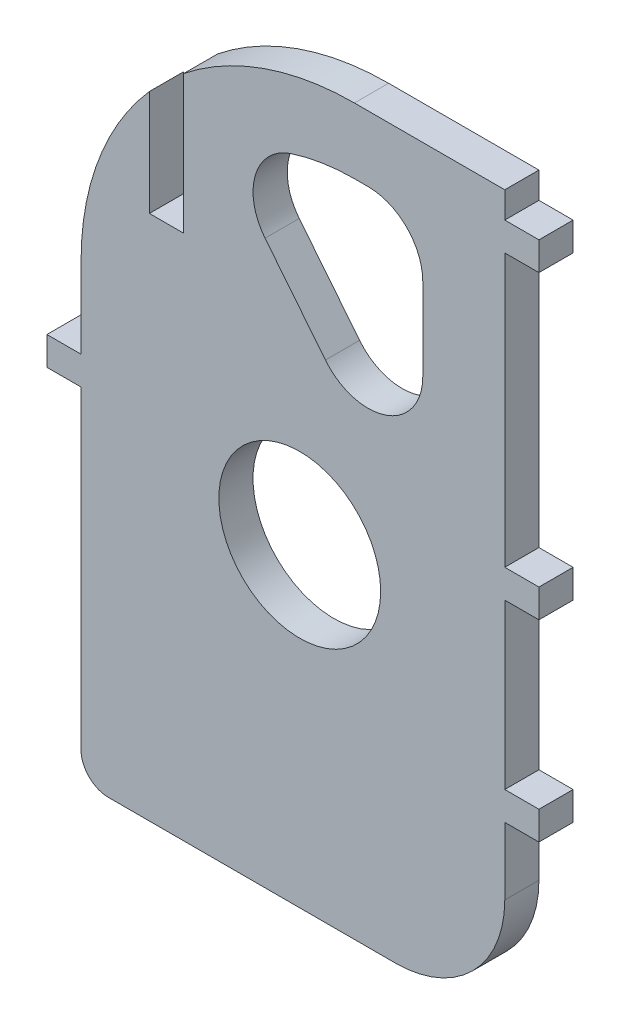
ISO-10303-21;
HEADER;
FILE_DESCRIPTION(('STEP AP214'),'2;1');
FILE_NAME('part.step','',(''),(''),'','','');
FILE_SCHEMA(('AUTOMOTIVE_DESIGN { 1 0 10303 214 1 1 1 1 }'));
ENDSEC;
DATA;
#1=APPLICATION_CONTEXT('core data for automotive mechanical design processes');
#2=APPLICATION_PROTOCOL_DEFINITION('international standard','automotive_design',2000,#1);
#3=PRODUCT_CONTEXT('',#1,'mechanical');
#4=PRODUCT('Part','Part','',(#3));
#5=PRODUCT_RELATED_PRODUCT_CATEGORY('part','',(#4));
#6=PRODUCT_DEFINITION_FORMATION('','',#4);
#7=PRODUCT_DEFINITION_CONTEXT('part definition',#1,'design');
#8=PRODUCT_DEFINITION('design','',#6,#7);
#9=PRODUCT_DEFINITION_SHAPE('','',#8);
#10=(LENGTH_UNIT() NAMED_UNIT(*) SI_UNIT(.MILLI.,.METRE.));
#11=(NAMED_UNIT(*) PLANE_ANGLE_UNIT() SI_UNIT($,.RADIAN.));
#12=(NAMED_UNIT(*) SI_UNIT($,.STERADIAN.) SOLID_ANGLE_UNIT());
#13=UNCERTAINTY_MEASURE_WITH_UNIT(LENGTH_MEASURE(1.E-05),#10,'distance_accuracy_value','');
#14=(GEOMETRIC_REPRESENTATION_CONTEXT(3) GLOBAL_UNCERTAINTY_ASSIGNED_CONTEXT((#13)) GLOBAL_UNIT_ASSIGNED_CONTEXT((#10,
#11,#12)) REPRESENTATION_CONTEXT('',''));
#15=CARTESIAN_POINT('',(0.,0.,0.));
#16=DIRECTION('',(0.,0.,1.));
#17=DIRECTION('',(1.,0.,0.));
#18=AXIS2_PLACEMENT_3D('',#15,#16,#17);
#19=CARTESIAN_POINT('',(2.53999999999988,6.35,1.5875));
#20=DIRECTION('',(0.,0.,-1.));
#21=DIRECTION('',(-1.,0.,0.));
#22=AXIS2_PLACEMENT_3D('',#19,#20,#21);
#23=CYLINDRICAL_SURFACE('',#22,12.7);
#24=CARTESIAN_POINT('',(2.53999999999988,6.35,0.));
#25=DIRECTION('',(0.,0.,1.));
#26=DIRECTION('',(1.,0.,0.));
#27=AXIS2_PLACEMENT_3D('',#24,#25,#26);
#28=CIRCLE('',#27,12.7);
#29=CARTESIAN_POINT('',(2.53999999999988,19.05,0.));
#30=VERTEX_POINT('',#29);
#31=CARTESIAN_POINT('',(-5.39750000000012,16.2639343224575,0.));
#32=VERTEX_POINT('',#31);
#33=EDGE_CURVE('E372',#30,#32,#28,.T.);
#34=ORIENTED_EDGE('',*,*,#33,.T.);
#35=DIRECTION('',(0.,0.,-1.));
#36=VECTOR('',#35,1.);
#37=CARTESIAN_POINT('',(-5.39750000000013,16.2639343224575,1.5875));
#38=LINE('',#37,#36);
#39=CARTESIAN_POINT('',(-5.39750000000012,16.2639343224575,1.5875));
#40=VERTEX_POINT('',#39);
#41=EDGE_CURVE('E307',#32,#40,#38,.F.);
#42=ORIENTED_EDGE('',*,*,#41,.T.);
#43=CARTESIAN_POINT('',(2.53999999999988,6.35,1.5875));
#44=DIRECTION('',(0.,0.,1.));
#45=DIRECTION('',(1.,0.,0.));
#46=AXIS2_PLACEMENT_3D('',#43,#44,#45);
#47=CIRCLE('',#46,12.7);
#48=CARTESIAN_POINT('',(2.53999999999988,19.05,1.5875));
#49=VERTEX_POINT('',#48);
#50=EDGE_CURVE('E319',#49,#40,#47,.T.);
#51=ORIENTED_EDGE('',*,*,#50,.F.);
#52=DIRECTION('',(0.,0.,-1.));
#53=VECTOR('',#52,1.);
#54=CARTESIAN_POINT('',(2.53999999999988,19.05,1.5875));
#55=LINE('',#54,#53);
#56=EDGE_CURVE('E462',#49,#30,#55,.T.);
#57=ORIENTED_EDGE('',*,*,#56,.T.);
#58=EDGE_LOOP('',(#34,#42,#51,#57));
#59=FACE_BOUND('',#58,.T.);
#60=ADVANCED_FACE('F35',(#59),#23,.T.);
#61=CARTESIAN_POINT('',(0.,19.05,1.5875));
#62=DIRECTION('',(0.,1.,0.));
#63=DIRECTION('',(0.,0.,1.));
#64=AXIS2_PLACEMENT_3D('',#61,#62,#63);
#65=PLANE('',#64);
#66=DIRECTION('',(1.,0.,0.));
#67=VECTOR('',#66,1.);
#68=CARTESIAN_POINT('',(0.,19.05,0.));
#69=LINE('',#68,#67);
#70=CARTESIAN_POINT('',(9.52499999999988,19.05,0.));
#71=VERTEX_POINT('',#70);
#72=EDGE_CURVE('E368',#30,#71,#69,.T.);
#73=ORIENTED_EDGE('',*,*,#72,.F.);
#74=ORIENTED_EDGE('',*,*,#56,.F.);
#75=DIRECTION('',(1.,0.,0.));
#76=VECTOR('',#75,1.);
#77=CARTESIAN_POINT('',(0.,19.05,1.5875));
#78=LINE('',#77,#76);
#79=CARTESIAN_POINT('',(9.52499999999988,19.05,1.5875));
#80=VERTEX_POINT('',#79);
#81=EDGE_CURVE('E314',#49,#80,#78,.T.);
#82=ORIENTED_EDGE('',*,*,#81,.T.);
#83=DIRECTION('',(0.,0.,-1.));
#84=VECTOR('',#83,1.);
#85=CARTESIAN_POINT('',(9.52499999999988,19.05,1.5875));
#86=LINE('',#85,#84);
#87=EDGE_CURVE('E422',#80,#71,#86,.T.);
#88=ORIENTED_EDGE('',*,*,#87,.T.);
#89=EDGE_LOOP('',(#73,#74,#82,#88));
#90=FACE_BOUND('',#89,.T.);
#91=ADVANCED_FACE('F520',(#90),#65,.T.);
#92=CARTESIAN_POINT('',(-6.98500000000012,14.7502604126301,1.5875));
#93=VERTEX_POINT('',#92);
#94=CARTESIAN_POINT('',(-10.1600000000001,6.35,1.5875));
#95=VERTEX_POINT('',#94);
#96=EDGE_CURVE('E318',#93,#95,#47,.T.);
#97=ORIENTED_EDGE('',*,*,#96,.F.);
#98=DIRECTION('',(0.,0.,-1.));
#99=VECTOR('',#98,1.);
#100=CARTESIAN_POINT('',(-6.98500000000012,14.7502604126301,1.5875));
#101=LINE('',#100,#99);
#102=CARTESIAN_POINT('',(-6.98500000000012,14.7502604126301,0.));
#103=VERTEX_POINT('',#102);
#104=EDGE_CURVE('E303',#93,#103,#101,.T.);
#105=ORIENTED_EDGE('',*,*,#104,.T.);
#106=CARTESIAN_POINT('',(-10.1600000000001,6.35,0.));
#107=VERTEX_POINT('',#106);
#108=EDGE_CURVE('E371',#103,#107,#28,.T.);
#109=ORIENTED_EDGE('',*,*,#108,.T.);
#110=DIRECTION('',(0.,0.,-1.));
#111=VECTOR('',#110,1.);
#112=CARTESIAN_POINT('',(-10.1600000000001,6.35,1.5875));
#113=LINE('',#112,#111);
#114=EDGE_CURVE('E459',#95,#107,#113,.T.);
#115=ORIENTED_EDGE('',*,*,#114,.F.);
#116=EDGE_LOOP('',(#97,#105,#109,#115));
#117=FACE_BOUND('',#116,.T.);
#118=ADVANCED_FACE('F523',(#117),#23,.T.);
#119=CARTESIAN_POINT('',(-10.1600000000001,0.,1.5875));
#120=DIRECTION('',(1.,0.,0.));
#121=DIRECTION('',(0.,1.,0.));
#122=AXIS2_PLACEMENT_3D('',#119,#120,#121);
#123=PLANE('',#122);
#124=DIRECTION('',(0.,-1.,0.));
#125=VECTOR('',#124,1.);
#126=CARTESIAN_POINT('',(-10.1600000000001,0.,0.));
#127=LINE('',#126,#125);
#128=CARTESIAN_POINT('',(-10.1600000000001,2.5908,0.));
#129=VERTEX_POINT('',#128);
#130=EDGE_CURVE('E375',#107,#129,#127,.T.);
#131=ORIENTED_EDGE('',*,*,#130,.T.);
#132=DIRECTION('',(0.,0.,-1.));
#133=VECTOR('',#132,1.);
#134=CARTESIAN_POINT('',(-10.1600000000001,2.5908,1.5875));
#135=LINE('',#134,#133);
#136=CARTESIAN_POINT('',(-10.1600000000001,2.5908,1.5875));
#137=VERTEX_POINT('',#136);
#138=EDGE_CURVE('E457',#137,#129,#135,.T.);
#139=ORIENTED_EDGE('',*,*,#138,.F.);
#140=DIRECTION('',(0.,-1.,0.));
#141=VECTOR('',#140,1.);
#142=CARTESIAN_POINT('',(-10.1600000000001,0.,1.5875));
#143=LINE('',#142,#141);
#144=EDGE_CURVE('E322',#95,#137,#143,.T.);
#145=ORIENTED_EDGE('',*,*,#144,.F.);
#146=ORIENTED_EDGE('',*,*,#114,.T.);
#147=EDGE_LOOP('',(#131,#139,#145,#146));
#148=FACE_BOUND('',#147,.T.);
#149=ADVANCED_FACE('F531',(#148),#123,.F.);
#150=CARTESIAN_POINT('',(0.,2.5908,1.5875));
#151=DIRECTION('',(0.,1.,0.));
#152=DIRECTION('',(0.,0.,1.));
#153=AXIS2_PLACEMENT_3D('',#150,#151,#152);
#154=PLANE('',#153);
#155=DIRECTION('',(1.,0.,0.));
#156=VECTOR('',#155,1.);
#157=CARTESIAN_POINT('',(0.,2.5908,0.));
#158=LINE('',#157,#156);
#159=CARTESIAN_POINT('',(-11.7475000000001,2.5908,0.));
#160=VERTEX_POINT('',#159);
#161=EDGE_CURVE('E378',#160,#129,#158,.T.);
#162=ORIENTED_EDGE('',*,*,#161,.F.);
#163=DIRECTION('',(0.,0.,-1.));
#164=VECTOR('',#163,1.);
#165=CARTESIAN_POINT('',(-11.7475000000001,2.5908,1.5875));
#166=LINE('',#165,#164);
#167=CARTESIAN_POINT('',(-11.7475000000001,2.5908,1.5875));
#168=VERTEX_POINT('',#167);
#169=EDGE_CURVE('E455',#168,#160,#166,.T.);
#170=ORIENTED_EDGE('',*,*,#169,.F.);
#171=DIRECTION('',(1.,0.,0.));
#172=VECTOR('',#171,1.);
#173=CARTESIAN_POINT('',(0.,2.5908,1.5875));
#174=LINE('',#173,#172);
#175=EDGE_CURVE('E324',#168,#137,#174,.T.);
#176=ORIENTED_EDGE('',*,*,#175,.T.);
#177=ORIENTED_EDGE('',*,*,#138,.T.);
#178=EDGE_LOOP('',(#162,#170,#176,#177));
#179=FACE_BOUND('',#178,.T.);
#180=ADVANCED_FACE('F536',(#179),#154,.T.);
#181=CARTESIAN_POINT('',(-11.7475000000001,0.,1.5875));
#182=DIRECTION('',(-1.,0.,0.));
#183=DIRECTION('',(0.,0.,1.));
#184=AXIS2_PLACEMENT_3D('',#181,#182,#183);
#185=PLANE('',#184);
#186=DIRECTION('',(0.,1.,0.));
#187=VECTOR('',#186,1.);
#188=CARTESIAN_POINT('',(-11.7475000000001,0.,0.));
#189=LINE('',#188,#187);
#190=CARTESIAN_POINT('',(-11.7475000000001,1.27,0.));
#191=VERTEX_POINT('',#190);
#192=EDGE_CURVE('E382',#191,#160,#189,.T.);
#193=ORIENTED_EDGE('',*,*,#192,.F.);
#194=DIRECTION('',(0.,0.,-1.));
#195=VECTOR('',#194,1.);
#196=CARTESIAN_POINT('',(-11.7475000000001,1.27,1.5875));
#197=LINE('',#196,#195);
#198=CARTESIAN_POINT('',(-11.7475000000001,1.27,1.5875));
#199=VERTEX_POINT('',#198);
#200=EDGE_CURVE('E453',#199,#191,#197,.T.);
#201=ORIENTED_EDGE('',*,*,#200,.F.);
#202=DIRECTION('',(0.,1.,0.));
#203=VECTOR('',#202,1.);
#204=CARTESIAN_POINT('',(-11.7475000000001,0.,1.5875));
#205=LINE('',#204,#203);
#206=EDGE_CURVE('E328',#199,#168,#205,.T.);
#207=ORIENTED_EDGE('',*,*,#206,.T.);
#208=ORIENTED_EDGE('',*,*,#169,.T.);
#209=EDGE_LOOP('',(#193,#201,#207,#208));
#210=FACE_BOUND('',#209,.T.);
#211=ADVANCED_FACE('F554',(#210),#185,.T.);
#212=CARTESIAN_POINT('',(0.,1.27,1.5875));
#213=DIRECTION('',(0.,1.,0.));
#214=DIRECTION('',(0.,0.,1.));
#215=AXIS2_PLACEMENT_3D('',#212,#213,#214);
#216=PLANE('',#215);
#217=DIRECTION('',(1.,0.,0.));
#218=VECTOR('',#217,1.);
#219=CARTESIAN_POINT('',(0.,1.27,0.));
#220=LINE('',#219,#218);
#221=CARTESIAN_POINT('',(-10.1600000000001,1.27,0.));
#222=VERTEX_POINT('',#221);
#223=EDGE_CURVE('E385',#191,#222,#220,.T.);
#224=ORIENTED_EDGE('',*,*,#223,.T.);
#225=DIRECTION('',(0.,0.,-1.));
#226=VECTOR('',#225,1.);
#227=CARTESIAN_POINT('',(-10.1600000000001,1.27,1.5875));
#228=LINE('',#227,#226);
#229=CARTESIAN_POINT('',(-10.1600000000001,1.27,1.5875));
#230=VERTEX_POINT('',#229);
#231=EDGE_CURVE('E450',#230,#222,#228,.T.);
#232=ORIENTED_EDGE('',*,*,#231,.F.);
#233=DIRECTION('',(1.,0.,0.));
#234=VECTOR('',#233,1.);
#235=CARTESIAN_POINT('',(0.,1.27,1.5875));
#236=LINE('',#235,#234);
#237=EDGE_CURVE('E331',#199,#230,#236,.T.);
#238=ORIENTED_EDGE('',*,*,#237,.F.);
#239=ORIENTED_EDGE('',*,*,#200,.T.);
#240=EDGE_LOOP('',(#224,#232,#238,#239));
#241=FACE_BOUND('',#240,.T.);
#242=ADVANCED_FACE('F559',(#241),#216,.F.);
#243=CARTESIAN_POINT('',(-10.1600000000001,-13.335,0.));
#244=VERTEX_POINT('',#243);
#245=EDGE_CURVE('E379',#222,#244,#127,.T.);
#246=ORIENTED_EDGE('',*,*,#245,.T.);
#247=DIRECTION('',(0.,0.,-1.));
#248=VECTOR('',#247,1.);
#249=CARTESIAN_POINT('',(-10.1600000000001,-13.335,1.5875));
#250=LINE('',#249,#248);
#251=CARTESIAN_POINT('',(-10.1600000000001,-13.335,1.5875));
#252=VERTEX_POINT('',#251);
#253=EDGE_CURVE('E480',#244,#252,#250,.F.);
#254=ORIENTED_EDGE('',*,*,#253,.T.);
#255=EDGE_CURVE('E325',#230,#252,#143,.T.);
#256=ORIENTED_EDGE('',*,*,#255,.F.);
#257=ORIENTED_EDGE('',*,*,#231,.T.);
#258=EDGE_LOOP('',(#246,#254,#256,#257));
#259=FACE_BOUND('',#258,.T.);
#260=ADVANCED_FACE('F539',(#259),#123,.F.);
#261=CARTESIAN_POINT('',(0.,-14.605,1.5875));
#262=DIRECTION('',(0.,1.,0.));
#263=DIRECTION('',(0.,0.,1.));
#264=AXIS2_PLACEMENT_3D('',#261,#262,#263);
#265=PLANE('',#264);
#266=DIRECTION('',(1.,0.,0.));
#267=VECTOR('',#266,1.);
#268=CARTESIAN_POINT('',(0.,-14.605,1.5875));
#269=LINE('',#268,#267);
#270=CARTESIAN_POINT('',(-8.89000000000012,-14.605,1.5875));
#271=VERTEX_POINT('',#270);
#272=CARTESIAN_POINT('',(4.44499999999988,-14.605,1.5875));
#273=VERTEX_POINT('',#272);
#274=EDGE_CURVE('E334',#271,#273,#269,.T.);
#275=ORIENTED_EDGE('',*,*,#274,.F.);
#276=DIRECTION('',(0.,0.,-1.));
#277=VECTOR('',#276,1.);
#278=CARTESIAN_POINT('',(-8.89000000000012,-14.605,1.5875));
#279=LINE('',#278,#277);
#280=CARTESIAN_POINT('',(-8.89000000000012,-14.605,0.));
#281=VERTEX_POINT('',#280);
#282=EDGE_CURVE('E475',#271,#281,#279,.T.);
#283=ORIENTED_EDGE('',*,*,#282,.T.);
#284=DIRECTION('',(1.,0.,0.));
#285=VECTOR('',#284,1.);
#286=CARTESIAN_POINT('',(0.,-14.605,0.));
#287=LINE('',#286,#285);
#288=CARTESIAN_POINT('',(4.44499999999988,-14.605,0.));
#289=VERTEX_POINT('',#288);
#290=EDGE_CURVE('E388',#281,#289,#287,.T.);
#291=ORIENTED_EDGE('',*,*,#290,.T.);
#292=DIRECTION('',(0.,0.,-1.));
#293=VECTOR('',#292,1.);
#294=CARTESIAN_POINT('',(4.44499999999988,-14.605,1.5875));
#295=LINE('',#294,#293);
#296=EDGE_CURVE('E470',#289,#273,#295,.F.);
#297=ORIENTED_EDGE('',*,*,#296,.T.);
#298=EDGE_LOOP('',(#275,#283,#291,#297));
#299=FACE_BOUND('',#298,.T.);
#300=ADVANCED_FACE('F570',(#299),#265,.F.);
#301=CARTESIAN_POINT('',(9.52499999999988,0.,1.5875));
#302=DIRECTION('',(1.,0.,0.));
#303=DIRECTION('',(0.,1.,0.));
#304=AXIS2_PLACEMENT_3D('',#301,#302,#303);
#305=PLANE('',#304);
#306=DIRECTION('',(0.,-1.,0.));
#307=VECTOR('',#306,1.);
#308=CARTESIAN_POINT('',(9.52499999999988,0.,1.5875));
#309=LINE('',#308,#307);
#310=CARTESIAN_POINT('',(9.52499999999988,-6.4008,1.5875));
#311=VERTEX_POINT('',#310);
#312=CARTESIAN_POINT('',(9.52499999999988,-9.525,1.5875));
#313=VERTEX_POINT('',#312);
#314=EDGE_CURVE('E336',#311,#313,#309,.T.);
#315=ORIENTED_EDGE('',*,*,#314,.T.);
#316=DIRECTION('',(0.,0.,-1.));
#317=VECTOR('',#316,1.);
#318=CARTESIAN_POINT('',(9.52499999999988,-9.525,0.));
#319=LINE('',#318,#317);
#320=CARTESIAN_POINT('',(9.52499999999988,-9.525,0.));
#321=VERTEX_POINT('',#320);
#322=EDGE_CURVE('E464',#313,#321,#319,.T.);
#323=ORIENTED_EDGE('',*,*,#322,.T.);
#324=DIRECTION('',(0.,-1.,0.));
#325=VECTOR('',#324,1.);
#326=CARTESIAN_POINT('',(9.52499999999988,0.,0.));
#327=LINE('',#326,#325);
#328=CARTESIAN_POINT('',(9.52499999999988,-6.4008,0.));
#329=VERTEX_POINT('',#328);
#330=EDGE_CURVE('E390',#329,#321,#327,.T.);
#331=ORIENTED_EDGE('',*,*,#330,.F.);
#332=DIRECTION('',(0.,0.,-1.));
#333=VECTOR('',#332,1.);
#334=CARTESIAN_POINT('',(9.52499999999988,-6.4008,1.5875));
#335=LINE('',#334,#333);
#336=EDGE_CURVE('E448',#311,#329,#335,.T.);
#337=ORIENTED_EDGE('',*,*,#336,.F.);
#338=EDGE_LOOP('',(#315,#323,#331,#337));
#339=FACE_BOUND('',#338,.T.);
#340=ADVANCED_FACE('F584',(#339),#305,.T.);
#341=CARTESIAN_POINT('',(0.,-6.4008,1.5875));
#342=DIRECTION('',(0.,1.,0.));
#343=DIRECTION('',(0.,0.,1.));
#344=AXIS2_PLACEMENT_3D('',#341,#342,#343);
#345=PLANE('',#344);
#346=DIRECTION('',(1.,0.,0.));
#347=VECTOR('',#346,1.);
#348=CARTESIAN_POINT('',(0.,-6.4008,0.));
#349=LINE('',#348,#347);
#350=CARTESIAN_POINT('',(11.1124999999999,-6.4008,0.));
#351=VERTEX_POINT('',#350);
#352=EDGE_CURVE('E393',#329,#351,#349,.T.);
#353=ORIENTED_EDGE('',*,*,#352,.T.);
#354=DIRECTION('',(0.,0.,-1.));
#355=VECTOR('',#354,1.);
#356=CARTESIAN_POINT('',(11.1124999999999,-6.4008,1.5875));
#357=LINE('',#356,#355);
#358=CARTESIAN_POINT('',(11.1124999999999,-6.4008,1.5875));
#359=VERTEX_POINT('',#358);
#360=EDGE_CURVE('E446',#359,#351,#357,.T.);
#361=ORIENTED_EDGE('',*,*,#360,.F.);
#362=DIRECTION('',(1.,0.,0.));
#363=VECTOR('',#362,1.);
#364=CARTESIAN_POINT('',(0.,-6.4008,1.5875));
#365=LINE('',#364,#363);
#366=EDGE_CURVE('E339',#311,#359,#365,.T.);
#367=ORIENTED_EDGE('',*,*,#366,.F.);
#368=ORIENTED_EDGE('',*,*,#336,.T.);
#369=EDGE_LOOP('',(#353,#361,#367,#368));
#370=FACE_BOUND('',#369,.T.);
#371=ADVANCED_FACE('F588',(#370),#345,.F.);
#372=CARTESIAN_POINT('',(11.1124999999999,0.,1.5875));
#373=DIRECTION('',(1.,0.,0.));
#374=DIRECTION('',(0.,1.,0.));
#375=AXIS2_PLACEMENT_3D('',#372,#373,#374);
#376=PLANE('',#375);
#377=DIRECTION('',(0.,-1.,0.));
#378=VECTOR('',#377,1.);
#379=CARTESIAN_POINT('',(11.1124999999999,0.,0.));
#380=LINE('',#379,#378);
#381=CARTESIAN_POINT('',(11.1124999999999,-5.08,0.));
#382=VERTEX_POINT('',#381);
#383=EDGE_CURVE('E397',#382,#351,#380,.T.);
#384=ORIENTED_EDGE('',*,*,#383,.F.);
#385=DIRECTION('',(0.,0.,-1.));
#386=VECTOR('',#385,1.);
#387=CARTESIAN_POINT('',(11.1124999999999,-5.08,1.5875));
#388=LINE('',#387,#386);
#389=CARTESIAN_POINT('',(11.1124999999999,-5.08,1.5875));
#390=VERTEX_POINT('',#389);
#391=EDGE_CURVE('E444',#390,#382,#388,.T.);
#392=ORIENTED_EDGE('',*,*,#391,.F.);
#393=DIRECTION('',(0.,-1.,0.));
#394=VECTOR('',#393,1.);
#395=CARTESIAN_POINT('',(11.1124999999999,0.,1.5875));
#396=LINE('',#395,#394);
#397=EDGE_CURVE('E343',#390,#359,#396,.T.);
#398=ORIENTED_EDGE('',*,*,#397,.T.);
#399=ORIENTED_EDGE('',*,*,#360,.T.);
#400=EDGE_LOOP('',(#384,#392,#398,#399));
#401=FACE_BOUND('',#400,.T.);
#402=ADVANCED_FACE('F660',(#401),#376,.T.);
#403=CARTESIAN_POINT('',(0.,-5.08,1.5875));
#404=DIRECTION('',(0.,1.,0.));
#405=DIRECTION('',(0.,0.,1.));
#406=AXIS2_PLACEMENT_3D('',#403,#404,#405);
#407=PLANE('',#406);
#408=DIRECTION('',(1.,0.,0.));
#409=VECTOR('',#408,1.);
#410=CARTESIAN_POINT('',(0.,-5.08,0.));
#411=LINE('',#410,#409);
#412=CARTESIAN_POINT('',(9.52499999999988,-5.08,0.));
#413=VERTEX_POINT('',#412);
#414=EDGE_CURVE('E400',#413,#382,#411,.T.);
#415=ORIENTED_EDGE('',*,*,#414,.F.);
#416=DIRECTION('',(0.,0.,-1.));
#417=VECTOR('',#416,1.);
#418=CARTESIAN_POINT('',(9.52499999999988,-5.08,1.5875));
#419=LINE('',#418,#417);
#420=CARTESIAN_POINT('',(9.52499999999988,-5.08,1.5875));
#421=VERTEX_POINT('',#420);
#422=EDGE_CURVE('E442',#421,#413,#419,.T.);
#423=ORIENTED_EDGE('',*,*,#422,.F.);
#424=DIRECTION('',(1.,0.,0.));
#425=VECTOR('',#424,1.);
#426=CARTESIAN_POINT('',(0.,-5.08,1.5875));
#427=LINE('',#426,#425);
#428=EDGE_CURVE('E346',#421,#390,#427,.T.);
#429=ORIENTED_EDGE('',*,*,#428,.T.);
#430=ORIENTED_EDGE('',*,*,#391,.T.);
#431=EDGE_LOOP('',(#415,#423,#429,#430));
#432=FACE_BOUND('',#431,.T.);
#433=ADVANCED_FACE('F596',(#432),#407,.T.);
#434=CARTESIAN_POINT('',(9.52499999999988,2.54,0.));
#435=VERTEX_POINT('',#434);
#436=EDGE_CURVE('E394',#435,#413,#327,.T.);
#437=ORIENTED_EDGE('',*,*,#436,.F.);
#438=DIRECTION('',(0.,0.,-1.));
#439=VECTOR('',#438,1.);
#440=CARTESIAN_POINT('',(9.52499999999988,2.54,1.5875));
#441=LINE('',#440,#439);
#442=CARTESIAN_POINT('',(9.52499999999988,2.54,1.5875));
#443=VERTEX_POINT('',#442);
#444=EDGE_CURVE('E440',#443,#435,#441,.T.);
#445=ORIENTED_EDGE('',*,*,#444,.F.);
#446=EDGE_CURVE('E341',#443,#421,#309,.T.);
#447=ORIENTED_EDGE('',*,*,#446,.T.);
#448=ORIENTED_EDGE('',*,*,#422,.T.);
#449=EDGE_LOOP('',(#437,#445,#447,#448));
#450=FACE_BOUND('',#449,.T.);
#451=ADVANCED_FACE('F601',(#450),#305,.T.);
#452=CARTESIAN_POINT('',(0.,2.54,1.5875));
#453=DIRECTION('',(0.,1.,0.));
#454=DIRECTION('',(0.,0.,1.));
#455=AXIS2_PLACEMENT_3D('',#452,#453,#454);
#456=PLANE('',#455);
#457=DIRECTION('',(1.,0.,0.));
#458=VECTOR('',#457,1.);
#459=CARTESIAN_POINT('',(0.,2.54,0.));
#460=LINE('',#459,#458);
#461=CARTESIAN_POINT('',(11.1124999999999,2.54,0.));
#462=VERTEX_POINT('',#461);
#463=EDGE_CURVE('E403',#435,#462,#460,.T.);
#464=ORIENTED_EDGE('',*,*,#463,.T.);
#465=DIRECTION('',(0.,0.,-1.));
#466=VECTOR('',#465,1.);
#467=CARTESIAN_POINT('',(11.1124999999999,2.54,1.5875));
#468=LINE('',#467,#466);
#469=CARTESIAN_POINT('',(11.1124999999999,2.54,1.5875));
#470=VERTEX_POINT('',#469);
#471=EDGE_CURVE('E437',#470,#462,#468,.T.);
#472=ORIENTED_EDGE('',*,*,#471,.F.);
#473=DIRECTION('',(1.,0.,0.));
#474=VECTOR('',#473,1.);
#475=CARTESIAN_POINT('',(0.,2.54,1.5875));
#476=LINE('',#475,#474);
#477=EDGE_CURVE('E349',#443,#470,#476,.T.);
#478=ORIENTED_EDGE('',*,*,#477,.F.);
#479=ORIENTED_EDGE('',*,*,#444,.T.);
#480=EDGE_LOOP('',(#464,#472,#478,#479));
#481=FACE_BOUND('',#480,.T.);
#482=ADVANCED_FACE('F626',(#481),#456,.F.);
#483=CARTESIAN_POINT('',(11.1124999999999,0.,1.5875));
#484=DIRECTION('',(-1.,0.,0.));
#485=DIRECTION('',(0.,0.,1.));
#486=AXIS2_PLACEMENT_3D('',#483,#484,#485);
#487=PLANE('',#486);
#488=DIRECTION('',(0.,1.,0.));
#489=VECTOR('',#488,1.);
#490=CARTESIAN_POINT('',(11.1124999999999,0.,0.));
#491=LINE('',#490,#489);
#492=CARTESIAN_POINT('',(11.1124999999999,3.8608,0.));
#493=VERTEX_POINT('',#492);
#494=EDGE_CURVE('E406',#462,#493,#491,.T.);
#495=ORIENTED_EDGE('',*,*,#494,.T.);
#496=DIRECTION('',(0.,0.,-1.));
#497=VECTOR('',#496,1.);
#498=CARTESIAN_POINT('',(11.1124999999999,3.8608,1.5875));
#499=LINE('',#498,#497);
#500=CARTESIAN_POINT('',(11.1124999999999,3.8608,1.5875));
#501=VERTEX_POINT('',#500);
#502=EDGE_CURVE('E435',#501,#493,#499,.T.);
#503=ORIENTED_EDGE('',*,*,#502,.F.);
#504=DIRECTION('',(0.,1.,0.));
#505=VECTOR('',#504,1.);
#506=CARTESIAN_POINT('',(11.1124999999999,0.,1.5875));
#507=LINE('',#506,#505);
#508=EDGE_CURVE('E352',#470,#501,#507,.T.);
#509=ORIENTED_EDGE('',*,*,#508,.F.);
#510=ORIENTED_EDGE('',*,*,#471,.T.);
#511=EDGE_LOOP('',(#495,#503,#509,#510));
#512=FACE_BOUND('',#511,.T.);
#513=ADVANCED_FACE('F630',(#512),#487,.F.);
#514=CARTESIAN_POINT('',(0.,3.8608,1.5875));
#515=DIRECTION('',(0.,1.,0.));
#516=DIRECTION('',(-1.,0.,0.));
#517=AXIS2_PLACEMENT_3D('',#514,#515,#516);
#518=PLANE('',#517);
#519=DIRECTION('',(1.,0.,0.));
#520=VECTOR('',#519,1.);
#521=CARTESIAN_POINT('',(0.,3.8608,0.));
#522=LINE('',#521,#520);
#523=CARTESIAN_POINT('',(9.52499999999988,3.8608,0.));
#524=VERTEX_POINT('',#523);
#525=EDGE_CURVE('E409',#524,#493,#522,.T.);
#526=ORIENTED_EDGE('',*,*,#525,.F.);
#527=DIRECTION('',(0.,0.,-1.));
#528=VECTOR('',#527,1.);
#529=CARTESIAN_POINT('',(9.52499999999988,3.8608,1.5875));
#530=LINE('',#529,#528);
#531=CARTESIAN_POINT('',(9.52499999999988,3.8608,1.5875));
#532=VERTEX_POINT('',#531);
#533=EDGE_CURVE('E433',#532,#524,#530,.T.);
#534=ORIENTED_EDGE('',*,*,#533,.F.);
#535=DIRECTION('',(1.,0.,0.));
#536=VECTOR('',#535,1.);
#537=CARTESIAN_POINT('',(0.,3.8608,1.5875));
#538=LINE('',#537,#536);
#539=EDGE_CURVE('E354',#532,#501,#538,.T.);
#540=ORIENTED_EDGE('',*,*,#539,.T.);
#541=ORIENTED_EDGE('',*,*,#502,.T.);
#542=EDGE_LOOP('',(#526,#534,#540,#541));
#543=FACE_BOUND('',#542,.T.);
#544=ADVANCED_FACE('F633',(#543),#518,.T.);
#545=CARTESIAN_POINT('',(9.52499999999985,16.51,0.));
#546=VERTEX_POINT('',#545);
#547=EDGE_CURVE('E412',#546,#524,#327,.T.);
#548=ORIENTED_EDGE('',*,*,#547,.F.);
#549=DIRECTION('',(0.,0.,-1.));
#550=VECTOR('',#549,1.);
#551=CARTESIAN_POINT('',(9.52499999999985,16.51,1.5875));
#552=LINE('',#551,#550);
#553=CARTESIAN_POINT('',(9.52499999999985,16.51,1.5875));
#554=VERTEX_POINT('',#553);
#555=EDGE_CURVE('E431',#554,#546,#552,.T.);
#556=ORIENTED_EDGE('',*,*,#555,.F.);
#557=EDGE_CURVE('E357',#554,#532,#309,.T.);
#558=ORIENTED_EDGE('',*,*,#557,.T.);
#559=ORIENTED_EDGE('',*,*,#533,.T.);
#560=EDGE_LOOP('',(#548,#556,#558,#559));
#561=FACE_BOUND('',#560,.T.);
#562=ADVANCED_FACE('F634',(#561),#305,.T.);
#563=CARTESIAN_POINT('',(0.,16.51,1.5875));
#564=DIRECTION('',(0.,1.,0.));
#565=DIRECTION('',(0.,0.,1.));
#566=AXIS2_PLACEMENT_3D('',#563,#564,#565);
#567=PLANE('',#566);
#568=DIRECTION('',(1.,0.,0.));
#569=VECTOR('',#568,1.);
#570=CARTESIAN_POINT('',(0.,16.51,0.));
#571=LINE('',#570,#569);
#572=CARTESIAN_POINT('',(11.1124999999998,16.51,0.));
#573=VERTEX_POINT('',#572);
#574=EDGE_CURVE('E413',#546,#573,#571,.T.);
#575=ORIENTED_EDGE('',*,*,#574,.T.);
#576=DIRECTION('',(0.,0.,-1.));
#577=VECTOR('',#576,1.);
#578=CARTESIAN_POINT('',(11.1124999999998,16.51,1.5875));
#579=LINE('',#578,#577);
#580=CARTESIAN_POINT('',(11.1124999999998,16.51,1.5875));
#581=VERTEX_POINT('',#580);
#582=EDGE_CURVE('E428',#581,#573,#579,.T.);
#583=ORIENTED_EDGE('',*,*,#582,.F.);
#584=DIRECTION('',(1.,0.,0.));
#585=VECTOR('',#584,1.);
#586=CARTESIAN_POINT('',(0.,16.51,1.5875));
#587=LINE('',#586,#585);
#588=EDGE_CURVE('E358',#554,#581,#587,.T.);
#589=ORIENTED_EDGE('',*,*,#588,.F.);
#590=ORIENTED_EDGE('',*,*,#555,.T.);
#591=EDGE_LOOP('',(#575,#583,#589,#590));
#592=FACE_BOUND('',#591,.T.);
#593=ADVANCED_FACE('F638',(#592),#567,.F.);
#594=CARTESIAN_POINT('',(11.1124999999998,0.,1.5875));
#595=DIRECTION('',(-1.,0.,0.));
#596=DIRECTION('',(0.,-1.,0.));
#597=AXIS2_PLACEMENT_3D('',#594,#595,#596);
#598=PLANE('',#597);
#599=DIRECTION('',(0.,1.,0.));
#600=VECTOR('',#599,1.);
#601=CARTESIAN_POINT('',(11.1124999999998,0.,0.));
#602=LINE('',#601,#600);
#603=CARTESIAN_POINT('',(11.1124999999998,17.8308,0.));
#604=VERTEX_POINT('',#603);
#605=EDGE_CURVE('E416',#573,#604,#602,.T.);
#606=ORIENTED_EDGE('',*,*,#605,.T.);
#607=DIRECTION('',(0.,0.,-1.));
#608=VECTOR('',#607,1.);
#609=CARTESIAN_POINT('',(11.1124999999998,17.8308,1.5875));
#610=LINE('',#609,#608);
#611=CARTESIAN_POINT('',(11.1124999999998,17.8308,1.5875));
#612=VERTEX_POINT('',#611);
#613=EDGE_CURVE('E426',#612,#604,#610,.T.);
#614=ORIENTED_EDGE('',*,*,#613,.F.);
#615=DIRECTION('',(0.,1.,0.));
#616=VECTOR('',#615,1.);
#617=CARTESIAN_POINT('',(11.1124999999998,0.,1.5875));
#618=LINE('',#617,#616);
#619=EDGE_CURVE('E361',#581,#612,#618,.T.);
#620=ORIENTED_EDGE('',*,*,#619,.F.);
#621=ORIENTED_EDGE('',*,*,#582,.T.);
#622=EDGE_LOOP('',(#606,#614,#620,#621));
#623=FACE_BOUND('',#622,.T.);
#624=ADVANCED_FACE('F640',(#623),#598,.F.);
#625=CARTESIAN_POINT('',(0.,17.8308,1.5875));
#626=DIRECTION('',(0.,1.,0.));
#627=DIRECTION('',(0.,0.,1.));
#628=AXIS2_PLACEMENT_3D('',#625,#626,#627);
#629=PLANE('',#628);
#630=DIRECTION('',(1.,0.,0.));
#631=VECTOR('',#630,1.);
#632=CARTESIAN_POINT('',(0.,17.8308,0.));
#633=LINE('',#632,#631);
#634=CARTESIAN_POINT('',(9.52499999999988,17.8308,0.));
#635=VERTEX_POINT('',#634);
#636=EDGE_CURVE('E419',#635,#604,#633,.T.);
#637=ORIENTED_EDGE('',*,*,#636,.F.);
#638=DIRECTION('',(0.,0.,-1.));
#639=VECTOR('',#638,1.);
#640=CARTESIAN_POINT('',(9.52499999999988,17.8308,1.5875));
#641=LINE('',#640,#639);
#642=CARTESIAN_POINT('',(9.52499999999988,17.8308,1.5875));
#643=VERTEX_POINT('',#642);
#644=EDGE_CURVE('E424',#643,#635,#641,.T.);
#645=ORIENTED_EDGE('',*,*,#644,.F.);
#646=DIRECTION('',(1.,0.,0.));
#647=VECTOR('',#646,1.);
#648=CARTESIAN_POINT('',(0.,17.8308,1.5875));
#649=LINE('',#648,#647);
#650=EDGE_CURVE('E363',#643,#612,#649,.T.);
#651=ORIENTED_EDGE('',*,*,#650,.T.);
#652=ORIENTED_EDGE('',*,*,#613,.T.);
#653=EDGE_LOOP('',(#637,#645,#651,#652));
#654=FACE_BOUND('',#653,.T.);
#655=ADVANCED_FACE('F616',(#654),#629,.T.);
#656=CARTESIAN_POINT('',(0.,0.,1.5875));
#657=DIRECTION('',(0.,0.,-1.));
#658=DIRECTION('',(-1.,0.,0.));
#659=AXIS2_PLACEMENT_3D('',#656,#657,#658);
#660=CYLINDRICAL_SURFACE('',#659,3.7592);
#661=CARTESIAN_POINT('',(0.,0.,1.5875));
#662=DIRECTION('',(0.,0.,1.));
#663=DIRECTION('',(1.,0.,0.));
#664=AXIS2_PLACEMENT_3D('',#661,#662,#663);
#665=CIRCLE('',#664,3.7592);
#666=CARTESIAN_POINT('',(3.7592,0.,1.5875));
#667=VERTEX_POINT('',#666);
#668=EDGE_CURVE('E311',#667,#667,#665,.T.);
#669=ORIENTED_EDGE('',*,*,#668,.T.);
#670=EDGE_LOOP('',(#669));
#671=FACE_BOUND('',#670,.T.);
#672=CARTESIAN_POINT('',(0.,0.,0.));
#673=DIRECTION('',(0.,0.,1.));
#674=DIRECTION('',(1.,0.,0.));
#675=AXIS2_PLACEMENT_3D('',#672,#673,#674);
#676=CIRCLE('',#675,3.7592);
#677=CARTESIAN_POINT('',(3.7592,0.,0.));
#678=VERTEX_POINT('',#677);
#679=EDGE_CURVE('E310',#678,#678,#676,.T.);
#680=ORIENTED_EDGE('',*,*,#679,.F.);
#681=EDGE_LOOP('',(#680));
#682=FACE_BOUND('',#681,.T.);
#683=ADVANCED_FACE('F647',(#671,#682),#660,.F.);
#684=EDGE_CURVE('E315',#71,#635,#327,.T.);
#685=ORIENTED_EDGE('',*,*,#684,.F.);
#686=ORIENTED_EDGE('',*,*,#87,.F.);
#687=EDGE_CURVE('E340',#80,#643,#309,.T.);
#688=ORIENTED_EDGE('',*,*,#687,.T.);
#689=ORIENTED_EDGE('',*,*,#644,.T.);
#690=EDGE_LOOP('',(#685,#686,#688,#689));
#691=FACE_BOUND('',#690,.T.);
#692=ADVANCED_FACE('F610',(#691),#305,.T.);
#693=CARTESIAN_POINT('',(0.,0.,1.5875));
#694=DIRECTION('',(0.,0.,1.));
#695=DIRECTION('',(1.,0.,0.));
#696=AXIS2_PLACEMENT_3D('',#693,#694,#695);
#697=PLANE('',#696);
#698=DIRECTION('',(0.,1.,0.));
#699=VECTOR('',#698,1.);
#700=CARTESIAN_POINT('',(5.71499999999985,16.002,1.5875));
#701=LINE('',#700,#699);
#702=CARTESIAN_POINT('',(5.71499999999985,9.62088525420344,1.5875));
#703=VERTEX_POINT('',#702);
#704=CARTESIAN_POINT('',(5.71499999999985,13.462,1.5875));
#705=VERTEX_POINT('',#704);
#706=EDGE_CURVE('E264',#703,#705,#701,.T.);
#707=ORIENTED_EDGE('',*,*,#706,.F.);
#708=CARTESIAN_POINT('',(3.17499999999985,9.62088525420344,1.5875));
#709=DIRECTION('',(0.,0.,1.));
#710=DIRECTION('',(1.,0.,0.));
#711=AXIS2_PLACEMENT_3D('',#708,#709,#710);
#712=CIRCLE('',#711,2.54);
#713=CARTESIAN_POINT('',(1.19221313550836,8.03338525420344,1.5875));
#714=VERTEX_POINT('',#713);
#715=EDGE_CURVE('E500',#703,#714,#712,.F.);
#716=ORIENTED_EDGE('',*,*,#715,.T.);
#717=DIRECTION('',(0.625,-0.7806247497998,0.));
#718=VECTOR('',#717,1.);
#719=CARTESIAN_POINT('',(-3.49250000000012,13.8845900850677,1.5875));
#720=LINE('',#719,#718);
#721=CARTESIAN_POINT('',(-1.61185124372261,11.535660541339,1.5875));
#722=VERTEX_POINT('',#721);
#723=EDGE_CURVE('E273',#722,#714,#720,.T.);
#724=ORIENTED_EDGE('',*,*,#723,.F.);
#725=CARTESIAN_POINT('',(0.370935620768878,13.123160541339,1.5875));
#726=DIRECTION('',(0.,0.,1.));
#727=DIRECTION('',(1.,0.,0.));
#728=AXIS2_PLACEMENT_3D('',#725,#726,#727);
#729=CIRCLE('',#728,2.54);
#730=CARTESIAN_POINT('',(-0.403730228956478,15.54214644896,1.5875));
#731=VERTEX_POINT('',#730);
#732=EDGE_CURVE('E279',#722,#731,#729,.F.);
#733=ORIENTED_EDGE('',*,*,#732,.T.);
#734=CARTESIAN_POINT('',(2.53999999999988,6.35,1.5875));
#735=DIRECTION('',(0.,0.,1.));
#736=DIRECTION('',(1.,0.,0.));
#737=AXIS2_PLACEMENT_3D('',#734,#735,#736);
#738=CIRCLE('',#737,9.652);
#739=CARTESIAN_POINT('',(2.53999999999988,16.002,1.5875));
#740=VERTEX_POINT('',#739);
#741=EDGE_CURVE('E263',#740,#731,#738,.T.);
#742=ORIENTED_EDGE('',*,*,#741,.F.);
#743=DIRECTION('',(-1.,0.,0.));
#744=VECTOR('',#743,1.);
#745=CARTESIAN_POINT('',(5.71499999999985,16.002,1.5875));
#746=LINE('',#745,#744);
#747=CARTESIAN_POINT('',(3.17499999999985,16.002,1.5875));
#748=VERTEX_POINT('',#747);
#749=EDGE_CURVE('E256',#748,#740,#746,.T.);
#750=ORIENTED_EDGE('',*,*,#749,.F.);
#751=CARTESIAN_POINT('',(3.17499999999985,13.462,1.5875));
#752=DIRECTION('',(0.,0.,1.));
#753=DIRECTION('',(1.,0.,0.));
#754=AXIS2_PLACEMENT_3D('',#751,#752,#753);
#755=CIRCLE('',#754,2.54);
#756=EDGE_CURVE('E43',#748,#705,#755,.F.);
#757=ORIENTED_EDGE('',*,*,#756,.T.);
#758=EDGE_LOOP('',(#707,#716,#724,#733,#742,#750,#757));
#759=FACE_BOUND('',#758,.T.);
#760=DIRECTION('',(0.,-1.,0.));
#761=VECTOR('',#760,1.);
#762=CARTESIAN_POINT('',(-5.39750000000012,19.05,1.5875));
#763=LINE('',#762,#761);
#764=CARTESIAN_POINT('',(-5.39750000000013,9.8425,1.5875));
#765=VERTEX_POINT('',#764);
#766=EDGE_CURVE('E287',#40,#765,#763,.T.);
#767=ORIENTED_EDGE('',*,*,#766,.T.);
#768=DIRECTION('',(-1.,0.,0.));
#769=VECTOR('',#768,1.);
#770=CARTESIAN_POINT('',(-5.39750000000013,9.8425,1.5875));
#771=LINE('',#770,#769);
#772=CARTESIAN_POINT('',(-6.98500000000012,9.8425,1.5875));
#773=VERTEX_POINT('',#772);
#774=EDGE_CURVE('E290',#765,#773,#771,.T.);
#775=ORIENTED_EDGE('',*,*,#774,.T.);
#776=DIRECTION('',(0.,1.,0.));
#777=VECTOR('',#776,1.);
#778=CARTESIAN_POINT('',(-6.98500000000012,19.05,1.5875));
#779=LINE('',#778,#777);
#780=EDGE_CURVE('E294',#773,#93,#779,.T.);
#781=ORIENTED_EDGE('',*,*,#780,.T.);
#782=ORIENTED_EDGE('',*,*,#96,.T.);
#783=ORIENTED_EDGE('',*,*,#144,.T.);
#784=ORIENTED_EDGE('',*,*,#175,.F.);
#785=ORIENTED_EDGE('',*,*,#206,.F.);
#786=ORIENTED_EDGE('',*,*,#237,.T.);
#787=ORIENTED_EDGE('',*,*,#255,.T.);
#788=CARTESIAN_POINT('',(-8.89000000000012,-13.335,1.5875));
#789=DIRECTION('',(0.,0.,1.));
#790=DIRECTION('',(1.,0.,0.));
#791=AXIS2_PLACEMENT_3D('',#788,#789,#790);
#792=CIRCLE('',#791,1.27);
#793=EDGE_CURVE('E482',#252,#271,#792,.T.);
#794=ORIENTED_EDGE('',*,*,#793,.T.);
#795=ORIENTED_EDGE('',*,*,#274,.T.);
#796=CARTESIAN_POINT('',(4.44499999999988,-9.525,1.5875));
#797=DIRECTION('',(0.,0.,1.));
#798=DIRECTION('',(1.,0.,0.));
#799=AXIS2_PLACEMENT_3D('',#796,#797,#798);
#800=CIRCLE('',#799,5.08);
#801=EDGE_CURVE('E473',#273,#313,#800,.T.);
#802=ORIENTED_EDGE('',*,*,#801,.T.);
#803=ORIENTED_EDGE('',*,*,#314,.F.);
#804=ORIENTED_EDGE('',*,*,#366,.T.);
#805=ORIENTED_EDGE('',*,*,#397,.F.);
#806=ORIENTED_EDGE('',*,*,#428,.F.);
#807=ORIENTED_EDGE('',*,*,#446,.F.);
#808=ORIENTED_EDGE('',*,*,#477,.T.);
#809=ORIENTED_EDGE('',*,*,#508,.T.);
#810=ORIENTED_EDGE('',*,*,#539,.F.);
#811=ORIENTED_EDGE('',*,*,#557,.F.);
#812=ORIENTED_EDGE('',*,*,#588,.T.);
#813=ORIENTED_EDGE('',*,*,#619,.T.);
#814=ORIENTED_EDGE('',*,*,#650,.F.);
#815=ORIENTED_EDGE('',*,*,#687,.F.);
#816=ORIENTED_EDGE('',*,*,#81,.F.);
#817=ORIENTED_EDGE('',*,*,#50,.T.);
#818=EDGE_LOOP('',(#767,#775,#781,#782,#783,#784,#785,#786,#787,#794,#795,#802,#803,#804,#805,
#806,#807,#808,#809,#810,#811,#812,#813,#814,#815,#816,#817));
#819=FACE_BOUND('',#818,.T.);
#820=ORIENTED_EDGE('',*,*,#668,.F.);
#821=EDGE_LOOP('',(#820));
#822=FACE_BOUND('',#821,.T.);
#823=ADVANCED_FACE('F276',(#759,#819,#822),#697,.T.);
#824=CARTESIAN_POINT('',(0.,0.,0.));
#825=DIRECTION('',(0.,0.,1.));
#826=DIRECTION('',(1.,0.,0.));
#827=AXIS2_PLACEMENT_3D('',#824,#825,#826);
#828=PLANE('',#827);
#829=DIRECTION('',(-0.625,0.7806247497998,0.));
#830=VECTOR('',#829,1.);
#831=CARTESIAN_POINT('',(-3.49250000000012,13.8845900850677,0.));
#832=LINE('',#831,#830);
#833=CARTESIAN_POINT('',(1.19221313550836,8.03338525420344,0.));
#834=VERTEX_POINT('',#833);
#835=CARTESIAN_POINT('',(-1.61185124372261,11.535660541339,0.));
#836=VERTEX_POINT('',#835);
#837=EDGE_CURVE('E970',#834,#836,#832,.T.);
#838=ORIENTED_EDGE('',*,*,#837,.F.);
#839=CARTESIAN_POINT('',(3.17499999999985,9.62088525420344,0.));
#840=DIRECTION('',(0.,0.,1.));
#841=DIRECTION('',(1.,0.,0.));
#842=AXIS2_PLACEMENT_3D('',#839,#840,#841);
#843=CIRCLE('',#842,2.54);
#844=CARTESIAN_POINT('',(5.71499999999985,9.62088525420344,0.));
#845=VERTEX_POINT('',#844);
#846=EDGE_CURVE('E502',#834,#845,#843,.T.);
#847=ORIENTED_EDGE('',*,*,#846,.T.);
#848=DIRECTION('',(0.,-1.,0.));
#849=VECTOR('',#848,1.);
#850=CARTESIAN_POINT('',(5.71499999999985,16.002,0.));
#851=LINE('',#850,#849);
#852=CARTESIAN_POINT('',(5.71499999999985,13.462,0.));
#853=VERTEX_POINT('',#852);
#854=EDGE_CURVE('E511',#853,#845,#851,.T.);
#855=ORIENTED_EDGE('',*,*,#854,.F.);
#856=CARTESIAN_POINT('',(3.17499999999985,13.462,0.));
#857=DIRECTION('',(0.,0.,1.));
#858=DIRECTION('',(1.,0.,0.));
#859=AXIS2_PLACEMENT_3D('',#856,#857,#858);
#860=CIRCLE('',#859,2.54);
#861=CARTESIAN_POINT('',(3.17499999999985,16.002,0.));
#862=VERTEX_POINT('',#861);
#863=EDGE_CURVE('E11',#853,#862,#860,.T.);
#864=ORIENTED_EDGE('',*,*,#863,.T.);
#865=DIRECTION('',(1.,0.,0.));
#866=VECTOR('',#865,1.);
#867=CARTESIAN_POINT('',(5.71499999999985,16.002,0.));
#868=LINE('',#867,#866);
#869=CARTESIAN_POINT('',(2.53999999999988,16.002,0.));
#870=VERTEX_POINT('',#869);
#871=EDGE_CURVE('E272',#870,#862,#868,.T.);
#872=ORIENTED_EDGE('',*,*,#871,.F.);
#873=CARTESIAN_POINT('',(2.53999999999988,6.35,0.));
#874=DIRECTION('',(0.,0.,1.));
#875=DIRECTION('',(1.,0.,0.));
#876=AXIS2_PLACEMENT_3D('',#873,#874,#875);
#877=CIRCLE('',#876,9.652);
#878=CARTESIAN_POINT('',(-0.403730228956478,15.54214644896,0.));
#879=VERTEX_POINT('',#878);
#880=EDGE_CURVE('E271',#879,#870,#877,.F.);
#881=ORIENTED_EDGE('',*,*,#880,.F.);
#882=CARTESIAN_POINT('',(0.370935620768878,13.123160541339,0.));
#883=DIRECTION('',(0.,0.,1.));
#884=DIRECTION('',(1.,0.,0.));
#885=AXIS2_PLACEMENT_3D('',#882,#883,#884);
#886=CIRCLE('',#885,2.54);
#887=EDGE_CURVE('E505',#879,#836,#886,.T.);
#888=ORIENTED_EDGE('',*,*,#887,.T.);
#889=EDGE_LOOP('',(#838,#847,#855,#864,#872,#881,#888));
#890=FACE_BOUND('',#889,.T.);
#891=ORIENTED_EDGE('',*,*,#679,.T.);
#892=EDGE_LOOP('',(#891));
#893=FACE_BOUND('',#892,.T.);
#894=DIRECTION('',(-1.,0.,0.));
#895=VECTOR('',#894,1.);
#896=CARTESIAN_POINT('',(-5.39750000000013,9.8425,0.));
#897=LINE('',#896,#895);
#898=CARTESIAN_POINT('',(-5.39750000000013,9.8425,0.));
#899=VERTEX_POINT('',#898);
#900=CARTESIAN_POINT('',(-6.98500000000012,9.8425,0.));
#901=VERTEX_POINT('',#900);
#902=EDGE_CURVE('E286',#899,#901,#897,.T.);
#903=ORIENTED_EDGE('',*,*,#902,.F.);
#904=DIRECTION('',(0.,1.,0.));
#905=VECTOR('',#904,1.);
#906=CARTESIAN_POINT('',(-5.39750000000013,0.,0.));
#907=LINE('',#906,#905);
#908=EDGE_CURVE('E484',#899,#32,#907,.T.);
#909=ORIENTED_EDGE('',*,*,#908,.T.);
#910=ORIENTED_EDGE('',*,*,#33,.F.);
#911=ORIENTED_EDGE('',*,*,#72,.T.);
#912=ORIENTED_EDGE('',*,*,#684,.T.);
#913=ORIENTED_EDGE('',*,*,#636,.T.);
#914=ORIENTED_EDGE('',*,*,#605,.F.);
#915=ORIENTED_EDGE('',*,*,#574,.F.);
#916=ORIENTED_EDGE('',*,*,#547,.T.);
#917=ORIENTED_EDGE('',*,*,#525,.T.);
#918=ORIENTED_EDGE('',*,*,#494,.F.);
#919=ORIENTED_EDGE('',*,*,#463,.F.);
#920=ORIENTED_EDGE('',*,*,#436,.T.);
#921=ORIENTED_EDGE('',*,*,#414,.T.);
#922=ORIENTED_EDGE('',*,*,#383,.T.);
#923=ORIENTED_EDGE('',*,*,#352,.F.);
#924=ORIENTED_EDGE('',*,*,#330,.T.);
#925=CARTESIAN_POINT('',(4.44499999999988,-9.525,0.));
#926=DIRECTION('',(0.,0.,1.));
#927=DIRECTION('',(1.,0.,0.));
#928=AXIS2_PLACEMENT_3D('',#925,#926,#927);
#929=CIRCLE('',#928,5.08);
#930=EDGE_CURVE('E467',#321,#289,#929,.F.);
#931=ORIENTED_EDGE('',*,*,#930,.T.);
#932=ORIENTED_EDGE('',*,*,#290,.F.);
#933=CARTESIAN_POINT('',(-8.89000000000012,-13.335,0.));
#934=DIRECTION('',(0.,0.,1.));
#935=DIRECTION('',(1.,0.,0.));
#936=AXIS2_PLACEMENT_3D('',#933,#934,#935);
#937=CIRCLE('',#936,1.27);
#938=EDGE_CURVE('E478',#281,#244,#937,.F.);
#939=ORIENTED_EDGE('',*,*,#938,.T.);
#940=ORIENTED_EDGE('',*,*,#245,.F.);
#941=ORIENTED_EDGE('',*,*,#223,.F.);
#942=ORIENTED_EDGE('',*,*,#192,.T.);
#943=ORIENTED_EDGE('',*,*,#161,.T.);
#944=ORIENTED_EDGE('',*,*,#130,.F.);
#945=ORIENTED_EDGE('',*,*,#108,.F.);
#946=DIRECTION('',(0.,1.,0.));
#947=VECTOR('',#946,1.);
#948=CARTESIAN_POINT('',(-6.98500000000012,19.05,0.));
#949=LINE('',#948,#947);
#950=EDGE_CURVE('E291',#901,#103,#949,.T.);
#951=ORIENTED_EDGE('',*,*,#950,.F.);
#952=EDGE_LOOP('',(#903,#909,#910,#911,#912,#913,#914,#915,#916,#917,#918,#919,#920,#921,#922,
#923,#924,#931,#932,#939,#940,#941,#942,#943,#944,#945,#951));
#953=FACE_BOUND('',#952,.T.);
#954=ADVANCED_FACE('F573',(#890,#893,#953),#828,.F.);
#955=CARTESIAN_POINT('',(4.44499999999988,-9.525,1.5875));
#956=DIRECTION('',(0.,0.,1.));
#957=DIRECTION('',(1.,0.,0.));
#958=AXIS2_PLACEMENT_3D('',#955,#956,#957);
#959=CYLINDRICAL_SURFACE('',#958,5.08);
#960=ORIENTED_EDGE('',*,*,#801,.F.);
#961=ORIENTED_EDGE('',*,*,#296,.F.);
#962=ORIENTED_EDGE('',*,*,#930,.F.);
#963=ORIENTED_EDGE('',*,*,#322,.F.);
#964=EDGE_LOOP('',(#960,#961,#962,#963));
#965=FACE_BOUND('',#964,.T.);
#966=ADVANCED_FACE('F581',(#965),#959,.T.);
#967=CARTESIAN_POINT('',(-8.89000000000012,-13.335,1.5875));
#968=DIRECTION('',(0.,0.,-1.));
#969=DIRECTION('',(-1.,0.,0.));
#970=AXIS2_PLACEMENT_3D('',#967,#968,#969);
#971=CYLINDRICAL_SURFACE('',#970,1.27);
#972=ORIENTED_EDGE('',*,*,#793,.F.);
#973=ORIENTED_EDGE('',*,*,#253,.F.);
#974=ORIENTED_EDGE('',*,*,#938,.F.);
#975=ORIENTED_EDGE('',*,*,#282,.F.);
#976=EDGE_LOOP('',(#972,#973,#974,#975));
#977=FACE_BOUND('',#976,.T.);
#978=ADVANCED_FACE('F567',(#977),#971,.T.);
#979=CARTESIAN_POINT('',(-5.39750000000012,19.05,1.5875));
#980=DIRECTION('',(1.,0.,0.));
#981=DIRECTION('',(0.,1.,0.));
#982=AXIS2_PLACEMENT_3D('',#979,#980,#981);
#983=PLANE('',#982);
#984=ORIENTED_EDGE('',*,*,#908,.F.);
#985=DIRECTION('',(0.,0.,-1.));
#986=VECTOR('',#985,1.);
#987=CARTESIAN_POINT('',(-5.39750000000013,9.8425,1.5875));
#988=LINE('',#987,#986);
#989=EDGE_CURVE('E297',#765,#899,#988,.T.);
#990=ORIENTED_EDGE('',*,*,#989,.F.);
#991=ORIENTED_EDGE('',*,*,#766,.F.);
#992=ORIENTED_EDGE('',*,*,#41,.F.);
#993=EDGE_LOOP('',(#984,#990,#991,#992));
#994=FACE_BOUND('',#993,.T.);
#995=ADVANCED_FACE('F799',(#994),#983,.F.);
#996=CARTESIAN_POINT('',(-6.98500000000012,19.05,1.5875));
#997=DIRECTION('',(-1.,0.,0.));
#998=DIRECTION('',(0.,-1.,0.));
#999=AXIS2_PLACEMENT_3D('',#996,#997,#998);
#1000=PLANE('',#999);
#1001=ORIENTED_EDGE('',*,*,#780,.F.);
#1002=DIRECTION('',(0.,0.,-1.));
#1003=VECTOR('',#1002,1.);
#1004=CARTESIAN_POINT('',(-6.98500000000012,9.8425,1.5875));
#1005=LINE('',#1004,#1003);
#1006=EDGE_CURVE('E301',#773,#901,#1005,.T.);
#1007=ORIENTED_EDGE('',*,*,#1006,.T.);
#1008=ORIENTED_EDGE('',*,*,#950,.T.);
#1009=ORIENTED_EDGE('',*,*,#104,.F.);
#1010=EDGE_LOOP('',(#1001,#1007,#1008,#1009));
#1011=FACE_BOUND('',#1010,.T.);
#1012=ADVANCED_FACE('F806',(#1011),#1000,.F.);
#1013=CARTESIAN_POINT('',(-5.39750000000013,9.8425,1.5875));
#1014=DIRECTION('',(0.,-1.,0.));
#1015=DIRECTION('',(0.,0.,-1.));
#1016=AXIS2_PLACEMENT_3D('',#1013,#1014,#1015);
#1017=PLANE('',#1016);
#1018=ORIENTED_EDGE('',*,*,#902,.T.);
#1019=ORIENTED_EDGE('',*,*,#1006,.F.);
#1020=ORIENTED_EDGE('',*,*,#774,.F.);
#1021=ORIENTED_EDGE('',*,*,#989,.T.);
#1022=EDGE_LOOP('',(#1018,#1019,#1020,#1021));
#1023=FACE_BOUND('',#1022,.T.);
#1024=ADVANCED_FACE('F814',(#1023),#1017,.F.);
#1025=CARTESIAN_POINT('',(5.71499999999985,16.002,-0.000999999999999916));
#1026=DIRECTION('',(1.,0.,0.));
#1027=DIRECTION('',(0.,1.,0.));
#1028=AXIS2_PLACEMENT_3D('',#1025,#1026,#1027);
#1029=PLANE('',#1028);
#1030=ORIENTED_EDGE('',*,*,#854,.T.);
#1031=DIRECTION('',(0.,0.,1.));
#1032=VECTOR('',#1031,1.);
#1033=CARTESIAN_POINT('',(5.71499999999985,9.62088525420344,1.5875));
#1034=LINE('',#1033,#1032);
#1035=EDGE_CURVE('E489',#845,#703,#1034,.T.);
#1036=ORIENTED_EDGE('',*,*,#1035,.T.);
#1037=ORIENTED_EDGE('',*,*,#706,.T.);
#1038=DIRECTION('',(0.,0.,1.));
#1039=VECTOR('',#1038,1.);
#1040=CARTESIAN_POINT('',(5.71499999999985,13.462,0.));
#1041=LINE('',#1040,#1039);
#1042=EDGE_CURVE('E487',#705,#853,#1041,.F.);
#1043=ORIENTED_EDGE('',*,*,#1042,.T.);
#1044=EDGE_LOOP('',(#1030,#1036,#1037,#1043));
#1045=FACE_BOUND('',#1044,.T.);
#1046=ADVANCED_FACE('F509',(#1045),#1029,.F.);
#1047=CARTESIAN_POINT('',(-3.49250000000012,13.8845900850677,-0.000999999999999916));
#1048=DIRECTION('',(-0.7806247497998,-0.625,0.));
#1049=DIRECTION('',(0.625,-0.7806247497998,0.));
#1050=AXIS2_PLACEMENT_3D('',#1047,#1048,#1049);
#1051=PLANE('',#1050);
#1052=ORIENTED_EDGE('',*,*,#723,.T.);
#1053=DIRECTION('',(0.,0.,1.));
#1054=VECTOR('',#1053,1.);
#1055=CARTESIAN_POINT('',(1.19221313550836,8.03338525420344,0.));
#1056=LINE('',#1055,#1054);
#1057=EDGE_CURVE('E495',#714,#834,#1056,.F.);
#1058=ORIENTED_EDGE('',*,*,#1057,.T.);
#1059=ORIENTED_EDGE('',*,*,#837,.T.);
#1060=DIRECTION('',(0.,0.,-1.));
#1061=VECTOR('',#1060,1.);
#1062=CARTESIAN_POINT('',(-1.61185124372261,11.535660541339,1.5875));
#1063=LINE('',#1062,#1061);
#1064=EDGE_CURVE('E492',#836,#722,#1063,.F.);
#1065=ORIENTED_EDGE('',*,*,#1064,.T.);
#1066=EDGE_LOOP('',(#1052,#1058,#1059,#1065));
#1067=FACE_BOUND('',#1066,.T.);
#1068=ADVANCED_FACE('F827',(#1067),#1051,.F.);
#1069=CARTESIAN_POINT('',(2.53999999999988,6.35,-0.000999999999999916));
#1070=DIRECTION('',(0.,0.,1.));
#1071=DIRECTION('',(1.,0.,0.));
#1072=AXIS2_PLACEMENT_3D('',#1069,#1070,#1071);
#1073=CYLINDRICAL_SURFACE('',#1072,9.652);
#1074=ORIENTED_EDGE('',*,*,#741,.T.);
#1075=DIRECTION('',(0.,0.,1.));
#1076=VECTOR('',#1075,1.);
#1077=CARTESIAN_POINT('',(-0.403730228956478,15.54214644896,-0.000999999999999916));
#1078=LINE('',#1077,#1076);
#1079=EDGE_CURVE('E497',#731,#879,#1078,.F.);
#1080=ORIENTED_EDGE('',*,*,#1079,.T.);
#1081=ORIENTED_EDGE('',*,*,#880,.T.);
#1082=DIRECTION('',(0.,0.,1.));
#1083=VECTOR('',#1082,1.);
#1084=CARTESIAN_POINT('',(2.53999999999988,16.002,-0.000999999999999916));
#1085=LINE('',#1084,#1083);
#1086=EDGE_CURVE('E259',#870,#740,#1085,.T.);
#1087=ORIENTED_EDGE('',*,*,#1086,.T.);
#1088=EDGE_LOOP('',(#1074,#1080,#1081,#1087));
#1089=FACE_BOUND('',#1088,.T.);
#1090=ADVANCED_FACE('F268',(#1089),#1073,.F.);
#1091=CARTESIAN_POINT('',(5.71499999999985,16.002,-0.000999999999999916));
#1092=DIRECTION('',(0.,1.,0.));
#1093=DIRECTION('',(0.,0.,1.));
#1094=AXIS2_PLACEMENT_3D('',#1091,#1092,#1093);
#1095=PLANE('',#1094);
#1096=ORIENTED_EDGE('',*,*,#871,.T.);
#1097=DIRECTION('',(0.,0.,1.));
#1098=VECTOR('',#1097,1.);
#1099=CARTESIAN_POINT('',(3.17499999999985,16.002,1.5875));
#1100=LINE('',#1099,#1098);
#1101=EDGE_CURVE('E260',#862,#748,#1100,.T.);
#1102=ORIENTED_EDGE('',*,*,#1101,.T.);
#1103=ORIENTED_EDGE('',*,*,#749,.T.);
#1104=ORIENTED_EDGE('',*,*,#1086,.F.);
#1105=EDGE_LOOP('',(#1096,#1102,#1103,#1104));
#1106=FACE_BOUND('',#1105,.T.);
#1107=ADVANCED_FACE('F258',(#1106),#1095,.F.);
#1108=CARTESIAN_POINT('',(3.17499999999985,9.62088525420344,-0.000999999999999916));
#1109=DIRECTION('',(0.,0.,-1.));
#1110=DIRECTION('',(-1.,0.,0.));
#1111=AXIS2_PLACEMENT_3D('',#1108,#1109,#1110);
#1112=CYLINDRICAL_SURFACE('',#1111,2.54);
#1113=ORIENTED_EDGE('',*,*,#846,.F.);
#1114=ORIENTED_EDGE('',*,*,#1057,.F.);
#1115=ORIENTED_EDGE('',*,*,#715,.F.);
#1116=ORIENTED_EDGE('',*,*,#1035,.F.);
#1117=EDGE_LOOP('',(#1113,#1114,#1115,#1116));
#1118=FACE_BOUND('',#1117,.T.);
#1119=ADVANCED_FACE('F517',(#1118),#1112,.F.);
#1120=CARTESIAN_POINT('',(0.370935620768878,13.123160541339,-0.000999999999999916));
#1121=DIRECTION('',(0.,0.,1.));
#1122=DIRECTION('',(1.,0.,0.));
#1123=AXIS2_PLACEMENT_3D('',#1120,#1121,#1122);
#1124=CYLINDRICAL_SURFACE('',#1123,2.54);
#1125=ORIENTED_EDGE('',*,*,#887,.F.);
#1126=ORIENTED_EDGE('',*,*,#1079,.F.);
#1127=ORIENTED_EDGE('',*,*,#732,.F.);
#1128=ORIENTED_EDGE('',*,*,#1064,.F.);
#1129=EDGE_LOOP('',(#1125,#1126,#1127,#1128));
#1130=FACE_BOUND('',#1129,.T.);
#1131=ADVANCED_FACE('F513',(#1130),#1124,.F.);
#1132=CARTESIAN_POINT('',(3.17499999999985,13.462,-0.000999999999999916));
#1133=DIRECTION('',(0.,0.,-1.));
#1134=DIRECTION('',(-1.,0.,0.));
#1135=AXIS2_PLACEMENT_3D('',#1132,#1133,#1134);
#1136=CYLINDRICAL_SURFACE('',#1135,2.54);
#1137=ORIENTED_EDGE('',*,*,#863,.F.);
#1138=ORIENTED_EDGE('',*,*,#1042,.F.);
#1139=ORIENTED_EDGE('',*,*,#756,.F.);
#1140=ORIENTED_EDGE('',*,*,#1101,.F.);
#1141=EDGE_LOOP('',(#1137,#1138,#1139,#1140));
#1142=FACE_BOUND('',#1141,.T.);
#1143=ADVANCED_FACE('F37',(#1142),#1136,.F.);
#1144=CLOSED_SHELL('',(#60,#91,#118,#149,#180,#211,#242,#260,#300,#340,#371,#402,#433,#451,#482,
#513,#544,#562,#593,#624,#655,#683,#692,#823,#954,#966,#978,#995,#1012,#1024,#1046,#1068,#1090,
#1107,#1119,#1131,#1143));
#1145=MANIFOLD_SOLID_BREP('B2',#1144);
#1146=ADVANCED_BREP_SHAPE_REPRESENTATION('',(#18,#1145),#14);
#1147=SHAPE_DEFINITION_REPRESENTATION(#9,#1146);
ENDSEC;
END-ISO-10303-21;
